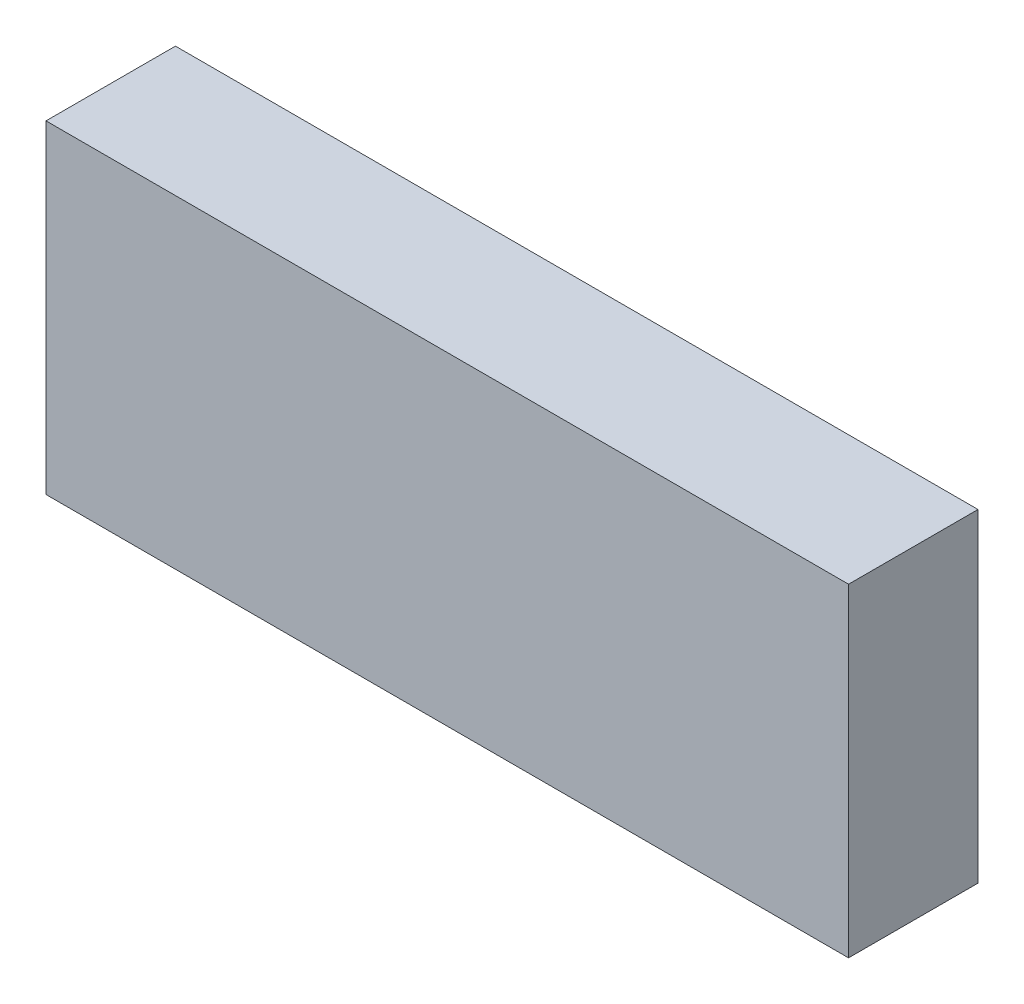
ISO-10303-21;
HEADER;
FILE_DESCRIPTION(('STEP AP214'),'2;1');
FILE_NAME('part.step','',(''),(''),'','','');
FILE_SCHEMA(('AUTOMOTIVE_DESIGN { 1 0 10303 214 1 1 1 1 }'));
ENDSEC;
DATA;
#1=APPLICATION_CONTEXT('core data for automotive mechanical design processes');
#2=APPLICATION_PROTOCOL_DEFINITION('international standard','automotive_design',2000,#1);
#3=PRODUCT_CONTEXT('',#1,'mechanical');
#4=PRODUCT('Part','Part','',(#3));
#5=PRODUCT_RELATED_PRODUCT_CATEGORY('part','',(#4));
#6=PRODUCT_DEFINITION_FORMATION('','',#4);
#7=PRODUCT_DEFINITION_CONTEXT('part definition',#1,'design');
#8=PRODUCT_DEFINITION('design','',#6,#7);
#9=PRODUCT_DEFINITION_SHAPE('','',#8);
#10=(LENGTH_UNIT() NAMED_UNIT(*) SI_UNIT(.MILLI.,.METRE.));
#11=(NAMED_UNIT(*) PLANE_ANGLE_UNIT() SI_UNIT($,.RADIAN.));
#12=(NAMED_UNIT(*) SI_UNIT($,.STERADIAN.) SOLID_ANGLE_UNIT());
#13=UNCERTAINTY_MEASURE_WITH_UNIT(LENGTH_MEASURE(1.E-05),#10,'distance_accuracy_value','');
#14=(GEOMETRIC_REPRESENTATION_CONTEXT(3) GLOBAL_UNCERTAINTY_ASSIGNED_CONTEXT((#13)) GLOBAL_UNIT_ASSIGNED_CONTEXT((#10,
#11,#12)) REPRESENTATION_CONTEXT('',''));
#15=CARTESIAN_POINT('',(0.,0.,0.));
#16=DIRECTION('',(0.,0.,1.));
#17=DIRECTION('',(1.,0.,0.));
#18=AXIS2_PLACEMENT_3D('',#15,#16,#17);
#19=CARTESIAN_POINT('',(0.,0.,2.));
#20=DIRECTION('',(1.,0.,0.));
#21=DIRECTION('',(0.,0.,-1.));
#22=AXIS2_PLACEMENT_3D('',#19,#20,#21);
#23=PLANE('',#22);
#24=DIRECTION('',(0.,-1.,0.));
#25=VECTOR('',#24,1.);
#26=CARTESIAN_POINT('',(0.,0.,0.));
#27=LINE('',#26,#25);
#28=CARTESIAN_POINT('',(0.,5.,0.));
#29=VERTEX_POINT('',#28);
#30=CARTESIAN_POINT('',(0.,0.,0.));
#31=VERTEX_POINT('',#30);
#32=EDGE_CURVE('E100',#29,#31,#27,.T.);
#33=ORIENTED_EDGE('',*,*,#32,.T.);
#34=DIRECTION('',(0.,0.,-1.));
#35=VECTOR('',#34,1.);
#36=CARTESIAN_POINT('',(0.,0.,2.));
#37=LINE('',#36,#35);
#38=CARTESIAN_POINT('',(0.,0.,2.));
#39=VERTEX_POINT('',#38);
#40=EDGE_CURVE('E11',#39,#31,#37,.T.);
#41=ORIENTED_EDGE('',*,*,#40,.F.);
#42=DIRECTION('',(0.,-1.,0.));
#43=VECTOR('',#42,1.);
#44=CARTESIAN_POINT('',(0.,0.,2.));
#45=LINE('',#44,#43);
#46=CARTESIAN_POINT('',(0.,5.,2.));
#47=VERTEX_POINT('',#46);
#48=EDGE_CURVE('E88',#47,#39,#45,.T.);
#49=ORIENTED_EDGE('',*,*,#48,.F.);
#50=DIRECTION('',(0.,0.,-1.));
#51=VECTOR('',#50,1.);
#52=CARTESIAN_POINT('',(0.,5.,2.));
#53=LINE('',#52,#51);
#54=EDGE_CURVE('E96',#47,#29,#53,.T.);
#55=ORIENTED_EDGE('',*,*,#54,.T.);
#56=EDGE_LOOP('',(#33,#41,#49,#55));
#57=FACE_BOUND('',#56,.T.);
#58=ADVANCED_FACE('F37',(#57),#23,.F.);
#59=CARTESIAN_POINT('',(0.,0.,2.));
#60=DIRECTION('',(0.,1.,0.));
#61=DIRECTION('',(0.,0.,1.));
#62=AXIS2_PLACEMENT_3D('',#59,#60,#61);
#63=PLANE('',#62);
#64=DIRECTION('',(1.,0.,0.));
#65=VECTOR('',#64,1.);
#66=CARTESIAN_POINT('',(0.,0.,0.));
#67=LINE('',#66,#65);
#68=CARTESIAN_POINT('',(12.4,0.,0.));
#69=VERTEX_POINT('',#68);
#70=EDGE_CURVE('E92',#31,#69,#67,.T.);
#71=ORIENTED_EDGE('',*,*,#70,.T.);
#72=DIRECTION('',(0.,0.,-1.));
#73=VECTOR('',#72,1.);
#74=CARTESIAN_POINT('',(12.4,0.,2.));
#75=LINE('',#74,#73);
#76=CARTESIAN_POINT('',(12.4,0.,2.));
#77=VERTEX_POINT('',#76);
#78=EDGE_CURVE('E45',#77,#69,#75,.T.);
#79=ORIENTED_EDGE('',*,*,#78,.F.);
#80=DIRECTION('',(1.,0.,0.));
#81=VECTOR('',#80,1.);
#82=CARTESIAN_POINT('',(0.,0.,2.));
#83=LINE('',#82,#81);
#84=EDGE_CURVE('E83',#39,#77,#83,.T.);
#85=ORIENTED_EDGE('',*,*,#84,.F.);
#86=ORIENTED_EDGE('',*,*,#40,.T.);
#87=EDGE_LOOP('',(#71,#79,#85,#86));
#88=FACE_BOUND('',#87,.T.);
#89=ADVANCED_FACE('F91',(#88),#63,.F.);
#90=CARTESIAN_POINT('',(12.4,0.,2.));
#91=DIRECTION('',(-1.,0.,0.));
#92=DIRECTION('',(0.,0.,1.));
#93=AXIS2_PLACEMENT_3D('',#90,#91,#92);
#94=PLANE('',#93);
#95=DIRECTION('',(0.,1.,0.));
#96=VECTOR('',#95,1.);
#97=CARTESIAN_POINT('',(12.4,0.,0.));
#98=LINE('',#97,#96);
#99=CARTESIAN_POINT('',(12.4,5.,0.));
#100=VERTEX_POINT('',#99);
#101=EDGE_CURVE('E70',#69,#100,#98,.T.);
#102=ORIENTED_EDGE('',*,*,#101,.T.);
#103=DIRECTION('',(0.,0.,-1.));
#104=VECTOR('',#103,1.);
#105=CARTESIAN_POINT('',(12.4,5.,2.));
#106=LINE('',#105,#104);
#107=CARTESIAN_POINT('',(12.4,5.,2.));
#108=VERTEX_POINT('',#107);
#109=EDGE_CURVE('E93',#108,#100,#106,.T.);
#110=ORIENTED_EDGE('',*,*,#109,.F.);
#111=DIRECTION('',(0.,1.,0.));
#112=VECTOR('',#111,1.);
#113=CARTESIAN_POINT('',(12.4,0.,2.));
#114=LINE('',#113,#112);
#115=EDGE_CURVE('E86',#77,#108,#114,.T.);
#116=ORIENTED_EDGE('',*,*,#115,.F.);
#117=ORIENTED_EDGE('',*,*,#78,.T.);
#118=EDGE_LOOP('',(#102,#110,#116,#117));
#119=FACE_BOUND('',#118,.T.);
#120=ADVANCED_FACE('F94',(#119),#94,.F.);
#121=CARTESIAN_POINT('',(0.,5.,2.));
#122=DIRECTION('',(0.,-1.,0.));
#123=DIRECTION('',(0.,0.,-1.));
#124=AXIS2_PLACEMENT_3D('',#121,#122,#123);
#125=PLANE('',#124);
#126=DIRECTION('',(-1.,0.,0.));
#127=VECTOR('',#126,1.);
#128=CARTESIAN_POINT('',(0.,5.,0.));
#129=LINE('',#128,#127);
#130=EDGE_CURVE('E76',#100,#29,#129,.T.);
#131=ORIENTED_EDGE('',*,*,#130,.T.);
#132=ORIENTED_EDGE('',*,*,#54,.F.);
#133=DIRECTION('',(-1.,0.,0.));
#134=VECTOR('',#133,1.);
#135=CARTESIAN_POINT('',(0.,5.,2.));
#136=LINE('',#135,#134);
#137=EDGE_CURVE('E53',#108,#47,#136,.T.);
#138=ORIENTED_EDGE('',*,*,#137,.F.);
#139=ORIENTED_EDGE('',*,*,#109,.T.);
#140=EDGE_LOOP('',(#131,#132,#138,#139));
#141=FACE_BOUND('',#140,.T.);
#142=ADVANCED_FACE('F107',(#141),#125,.F.);
#143=CARTESIAN_POINT('',(0.,0.,2.));
#144=DIRECTION('',(0.,0.,-1.));
#145=DIRECTION('',(-1.,0.,0.));
#146=AXIS2_PLACEMENT_3D('',#143,#144,#145);
#147=PLANE('',#146);
#148=ORIENTED_EDGE('',*,*,#48,.T.);
#149=ORIENTED_EDGE('',*,*,#84,.T.);
#150=ORIENTED_EDGE('',*,*,#115,.T.);
#151=ORIENTED_EDGE('',*,*,#137,.T.);
#152=EDGE_LOOP('',(#148,#149,#150,#151));
#153=FACE_BOUND('',#152,.T.);
#154=ADVANCED_FACE('F84',(#153),#147,.F.);
#155=CARTESIAN_POINT('',(0.,0.,0.));
#156=DIRECTION('',(0.,0.,-1.));
#157=DIRECTION('',(-1.,0.,0.));
#158=AXIS2_PLACEMENT_3D('',#155,#156,#157);
#159=PLANE('',#158);
#160=ORIENTED_EDGE('',*,*,#32,.F.);
#161=ORIENTED_EDGE('',*,*,#130,.F.);
#162=ORIENTED_EDGE('',*,*,#101,.F.);
#163=ORIENTED_EDGE('',*,*,#70,.F.);
#164=EDGE_LOOP('',(#160,#161,#162,#163));
#165=FACE_BOUND('',#164,.T.);
#166=ADVANCED_FACE('F110',(#165),#159,.T.);
#167=CLOSED_SHELL('',(#58,#89,#120,#142,#154,#166));
#168=MANIFOLD_SOLID_BREP('B2',#167);
#169=ADVANCED_BREP_SHAPE_REPRESENTATION('',(#18,#168),#14);
#170=SHAPE_DEFINITION_REPRESENTATION(#9,#169);
ENDSEC;
END-ISO-10303-21;
